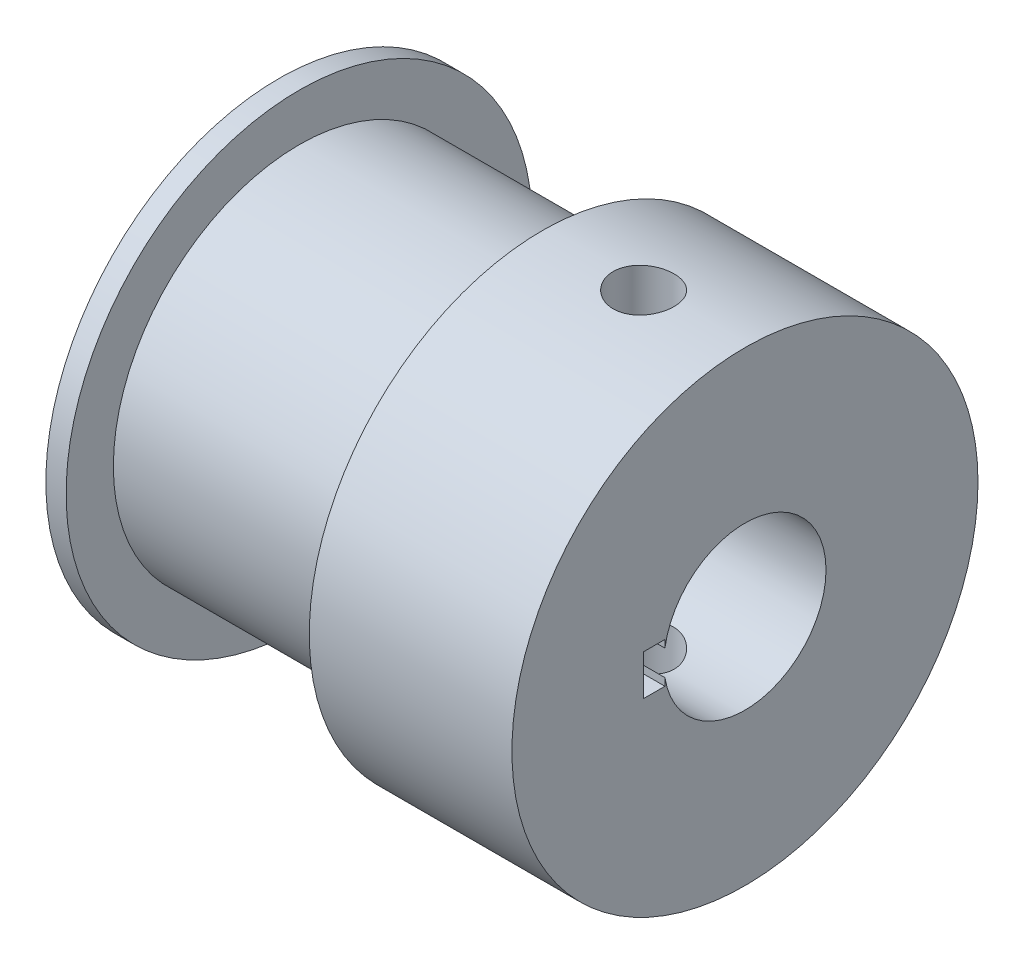
ISO-10303-21;
HEADER;
FILE_DESCRIPTION(('STEP AP214'),'2;1');
FILE_NAME('part.step','',(''),(''),'','','');
FILE_SCHEMA(('AUTOMOTIVE_DESIGN { 1 0 10303 214 1 1 1 1 }'));
ENDSEC;
DATA;
#1=APPLICATION_CONTEXT('core data for automotive mechanical design processes');
#2=APPLICATION_PROTOCOL_DEFINITION('international standard','automotive_design',2000,#1);
#3=PRODUCT_CONTEXT('',#1,'mechanical');
#4=PRODUCT('Part','Part','',(#3));
#5=PRODUCT_RELATED_PRODUCT_CATEGORY('part','',(#4));
#6=PRODUCT_DEFINITION_FORMATION('','',#4);
#7=PRODUCT_DEFINITION_CONTEXT('part definition',#1,'design');
#8=PRODUCT_DEFINITION('design','',#6,#7);
#9=PRODUCT_DEFINITION_SHAPE('','',#8);
#10=(LENGTH_UNIT() NAMED_UNIT(*) SI_UNIT(.MILLI.,.METRE.));
#11=(NAMED_UNIT(*) PLANE_ANGLE_UNIT() SI_UNIT($,.RADIAN.));
#12=(NAMED_UNIT(*) SI_UNIT($,.STERADIAN.) SOLID_ANGLE_UNIT());
#13=UNCERTAINTY_MEASURE_WITH_UNIT(LENGTH_MEASURE(1.E-05),#10,'distance_accuracy_value','');
#14=(GEOMETRIC_REPRESENTATION_CONTEXT(3) GLOBAL_UNCERTAINTY_ASSIGNED_CONTEXT((#13)) GLOBAL_UNIT_ASSIGNED_CONTEXT((#10,
#11,#12)) REPRESENTATION_CONTEXT('',''));
#15=CARTESIAN_POINT('',(0.,0.,0.));
#16=DIRECTION('',(0.,0.,1.));
#17=DIRECTION('',(1.,0.,0.));
#18=AXIS2_PLACEMENT_3D('',#15,#16,#17);
#19=CARTESIAN_POINT('',(0.007999999999981,11.5127,11.512749774016));
#20=DIRECTION('',(1.,0.,0.));
#21=DIRECTION('',(0.,0.,-1.));
#22=AXIS2_PLACEMENT_3D('',#19,#20,#21);
#23=CYLINDRICAL_SURFACE('',#22,11.5);
#24=CARTESIAN_POINT('',(0.007999999999996,11.5127,11.512749774016));
#25=DIRECTION('',(1.,0.,0.));
#26=DIRECTION('',(0.,0.,-1.));
#27=AXIS2_PLACEMENT_3D('',#24,#25,#26);
#28=CIRCLE('',#27,11.5);
#29=CARTESIAN_POINT('',(0.007999999999996,11.5127,0.012749774016));
#30=VERTEX_POINT('',#29);
#31=EDGE_CURVE('E19',#30,#30,#28,.T.);
#32=ORIENTED_EDGE('',*,*,#31,.T.);
#33=EDGE_LOOP('',(#32));
#34=FACE_BOUND('',#33,.T.);
#35=CARTESIAN_POINT('',(1.008,11.5127,11.512749774016));
#36=DIRECTION('',(1.,0.,0.));
#37=DIRECTION('',(0.,0.,-1.));
#38=AXIS2_PLACEMENT_3D('',#35,#36,#37);
#39=CIRCLE('',#38,11.5);
#40=CARTESIAN_POINT('',(1.008,11.5127,0.012749774016));
#41=VERTEX_POINT('',#40);
#42=EDGE_CURVE('E84',#41,#41,#39,.T.);
#43=ORIENTED_EDGE('',*,*,#42,.F.);
#44=EDGE_LOOP('',(#43));
#45=FACE_BOUND('',#44,.T.);
#46=ADVANCED_FACE('F16',(#34,#45),#23,.T.);
#47=CARTESIAN_POINT('',(1.008,11.5127,11.512749774016));
#48=DIRECTION('',(1.,0.,0.));
#49=DIRECTION('',(0.,0.,-1.));
#50=AXIS2_PLACEMENT_3D('',#47,#48,#49);
#51=PLANE('',#50);
#52=CARTESIAN_POINT('',(1.008,11.5127,11.512749774016));
#53=DIRECTION('',(1.,0.,0.));
#54=DIRECTION('',(0.,0.,-1.));
#55=AXIS2_PLACEMENT_3D('',#52,#53,#54);
#56=CIRCLE('',#55,9.168296585514);
#57=CARTESIAN_POINT('',(1.008,11.5127,2.344453188502));
#58=VERTEX_POINT('',#57);
#59=EDGE_CURVE('E123',#58,#58,#56,.T.);
#60=ORIENTED_EDGE('',*,*,#59,.F.);
#61=EDGE_LOOP('',(#60));
#62=FACE_BOUND('',#61,.T.);
#63=ORIENTED_EDGE('',*,*,#42,.T.);
#64=EDGE_LOOP('',(#63));
#65=FACE_BOUND('',#64,.T.);
#66=ADVANCED_FACE('F199',(#62,#65),#51,.T.);
#67=CARTESIAN_POINT('',(0.007999999999981,11.5127,11.512749774016));
#68=DIRECTION('',(1.,0.,0.));
#69=DIRECTION('',(0.,0.,-1.));
#70=AXIS2_PLACEMENT_3D('',#67,#68,#69);
#71=PLANE('',#70);
#72=DIRECTION('',(0.,0.,1.));
#73=VECTOR('',#72,1.);
#74=CARTESIAN_POINT('',(0.007999999999996,12.5127,15.462749774016));
#75=LINE('',#74,#73);
#76=CARTESIAN_POINT('',(0.007999999999996,12.5127,15.462749774016));
#77=VERTEX_POINT('',#76);
#78=CARTESIAN_POINT('',(0.00799999999999225,12.5127,16.5127497740164));
#79=VERTEX_POINT('',#78);
#80=EDGE_CURVE('E101',#77,#79,#75,.T.);
#81=ORIENTED_EDGE('',*,*,#80,.T.);
#82=DIRECTION('',(0.,1.,0.));
#83=VECTOR('',#82,1.);
#84=CARTESIAN_POINT('',(0.007999999999996,10.5127,16.512749774016));
#85=LINE('',#84,#83);
#86=CARTESIAN_POINT('',(0.0079999999999935,10.5127,16.5127497740162));
#87=VERTEX_POINT('',#86);
#88=EDGE_CURVE('E121',#79,#87,#85,.F.);
#89=ORIENTED_EDGE('',*,*,#88,.T.);
#90=DIRECTION('',(0.,0.,1.));
#91=VECTOR('',#90,1.);
#92=CARTESIAN_POINT('',(0.007999999999996,10.5127,15.462749774016));
#93=LINE('',#92,#91);
#94=CARTESIAN_POINT('',(0.007999999999996,10.5127,15.462749774016));
#95=VERTEX_POINT('',#94);
#96=EDGE_CURVE('E83',#95,#87,#93,.T.);
#97=ORIENTED_EDGE('',*,*,#96,.F.);
#98=DIRECTION('',(0.,1.,0.));
#99=VECTOR('',#98,1.);
#100=CARTESIAN_POINT('',(0.007999999999996,10.5127,15.462749774016));
#101=LINE('',#100,#99);
#102=CARTESIAN_POINT('',(0.007999999999996,10.8822239893541,15.462749774016));
#103=VERTEX_POINT('',#102);
#104=EDGE_CURVE('E81',#103,#95,#101,.F.);
#105=ORIENTED_EDGE('',*,*,#104,.F.);
#106=CARTESIAN_POINT('',(0.007999999999996,11.5127,11.512749774016));
#107=DIRECTION('',(1.,0.,0.));
#108=DIRECTION('',(0.,0.,-1.));
#109=AXIS2_PLACEMENT_3D('',#106,#107,#108);
#110=CIRCLE('',#109,4.);
#111=CARTESIAN_POINT('',(0.007999999999996,12.1431760106459,15.462749774016));
#112=VERTEX_POINT('',#111);
#113=EDGE_CURVE('E74',#112,#103,#110,.F.);
#114=ORIENTED_EDGE('',*,*,#113,.F.);
#115=DIRECTION('',(0.,1.,0.));
#116=VECTOR('',#115,1.);
#117=CARTESIAN_POINT('',(0.007999999999996,10.5127,15.462749774016));
#118=LINE('',#117,#116);
#119=EDGE_CURVE('E79',#77,#112,#118,.F.);
#120=ORIENTED_EDGE('',*,*,#119,.F.);
#121=EDGE_LOOP('',(#81,#89,#97,#105,#114,#120));
#122=FACE_BOUND('',#121,.T.);
#123=ORIENTED_EDGE('',*,*,#31,.F.);
#124=EDGE_LOOP('',(#123));
#125=FACE_BOUND('',#124,.T.);
#126=ADVANCED_FACE('F76',(#122,#125),#71,.F.);
#127=CARTESIAN_POINT('',(0.007999999999981,10.5127,15.462749774016));
#128=DIRECTION('',(0.,1.,0.));
#129=DIRECTION('',(0.,0.,1.));
#130=AXIS2_PLACEMENT_3D('',#127,#128,#129);
#131=PLANE('',#130);
#132=DIRECTION('',(1.,0.,0.));
#133=VECTOR('',#132,1.);
#134=CARTESIAN_POINT('',(0.007999999999981,10.5127,16.512749774016));
#135=LINE('',#134,#133);
#136=CARTESIAN_POINT('',(23.008,10.5127,16.5127497740169));
#137=VERTEX_POINT('',#136);
#138=EDGE_CURVE('E113',#87,#137,#135,.T.);
#139=ORIENTED_EDGE('',*,*,#138,.T.);
#140=DIRECTION('',(0.,0.,1.));
#141=VECTOR('',#140,1.);
#142=CARTESIAN_POINT('',(23.008,10.5127,15.462749774016));
#143=LINE('',#142,#141);
#144=CARTESIAN_POINT('',(23.008,10.5127,15.4627497740163));
#145=VERTEX_POINT('',#144);
#146=EDGE_CURVE('E109',#137,#145,#143,.F.);
#147=ORIENTED_EDGE('',*,*,#146,.T.);
#148=DIRECTION('',(1.,0.,0.));
#149=VECTOR('',#148,1.);
#150=CARTESIAN_POINT('',(0.007999999999981,10.5127,15.462749774016));
#151=LINE('',#150,#149);
#152=EDGE_CURVE('E226',#95,#145,#151,.T.);
#153=ORIENTED_EDGE('',*,*,#152,.F.);
#154=ORIENTED_EDGE('',*,*,#96,.T.);
#155=EDGE_LOOP('',(#139,#147,#153,#154));
#156=FACE_BOUND('',#155,.T.);
#157=ADVANCED_FACE('F194',(#156),#131,.T.);
#158=CARTESIAN_POINT('',(0.007999999999981,12.5127,15.462749774016));
#159=DIRECTION('',(0.,1.,0.));
#160=DIRECTION('',(0.,0.,1.));
#161=AXIS2_PLACEMENT_3D('',#158,#159,#160);
#162=PLANE('',#161);
#163=DIRECTION('',(1.,0.,0.));
#164=VECTOR('',#163,1.);
#165=CARTESIAN_POINT('',(0.007999999999981,12.5127,16.512749774016));
#166=LINE('',#165,#164);
#167=CARTESIAN_POINT('',(23.008,12.5127,16.5127497740168));
#168=VERTEX_POINT('',#167);
#169=EDGE_CURVE('E93',#168,#79,#166,.F.);
#170=ORIENTED_EDGE('',*,*,#169,.T.);
#171=ORIENTED_EDGE('',*,*,#80,.F.);
#172=DIRECTION('',(1.,0.,0.));
#173=VECTOR('',#172,1.);
#174=CARTESIAN_POINT('',(0.007999999999981,12.5127,15.462749774016));
#175=LINE('',#174,#173);
#176=CARTESIAN_POINT('',(23.008,12.5127,15.462749774016));
#177=VERTEX_POINT('',#176);
#178=EDGE_CURVE('E97',#177,#77,#175,.F.);
#179=ORIENTED_EDGE('',*,*,#178,.F.);
#180=DIRECTION('',(0.,0.,1.));
#181=VECTOR('',#180,1.);
#182=CARTESIAN_POINT('',(23.008,12.5127,15.462749774016));
#183=LINE('',#182,#181);
#184=EDGE_CURVE('E34',#168,#177,#183,.F.);
#185=ORIENTED_EDGE('',*,*,#184,.F.);
#186=EDGE_LOOP('',(#170,#171,#179,#185));
#187=FACE_BOUND('',#186,.T.);
#188=ADVANCED_FACE('F191',(#187),#162,.F.);
#189=CARTESIAN_POINT('',(0.007999999999981,10.5127,15.462749774016));
#190=DIRECTION('',(0.,0.,1.));
#191=DIRECTION('',(1.,0.,0.));
#192=AXIS2_PLACEMENT_3D('',#189,#190,#191);
#193=PLANE('',#192);
#194=DIRECTION('',(0.,1.,0.));
#195=VECTOR('',#194,1.);
#196=CARTESIAN_POINT('',(23.008,10.5127,15.462749774016));
#197=LINE('',#196,#195);
#198=CARTESIAN_POINT('',(23.008,12.1431760106459,15.462749774016));
#199=VERTEX_POINT('',#198);
#200=EDGE_CURVE('E98',#199,#177,#197,.T.);
#201=ORIENTED_EDGE('',*,*,#200,.T.);
#202=ORIENTED_EDGE('',*,*,#178,.T.);
#203=ORIENTED_EDGE('',*,*,#119,.T.);
#204=DIRECTION('',(1.,0.,0.));
#205=VECTOR('',#204,1.);
#206=CARTESIAN_POINT('',(13.008,12.1431760106458,15.462749774016));
#207=LINE('',#206,#205);
#208=EDGE_CURVE('E87',#112,#199,#207,.T.);
#209=ORIENTED_EDGE('',*,*,#208,.T.);
#210=EDGE_LOOP('',(#201,#202,#203,#209));
#211=FACE_BOUND('',#210,.T.);
#212=ADVANCED_FACE('F96',(#211),#193,.T.);
#213=CARTESIAN_POINT('',(0.007999999999981,10.5127,15.462749774016));
#214=DIRECTION('',(0.,0.,1.));
#215=DIRECTION('',(1.,0.,0.));
#216=AXIS2_PLACEMENT_3D('',#213,#214,#215);
#217=PLANE('',#216);
#218=DIRECTION('',(1.,0.,0.));
#219=VECTOR('',#218,1.);
#220=CARTESIAN_POINT('',(13.008,10.8822239893542,15.462749774016));
#221=LINE('',#220,#219);
#222=CARTESIAN_POINT('',(23.008,10.8822239893541,15.462749774016));
#223=VERTEX_POINT('',#222);
#224=EDGE_CURVE('E66',#223,#103,#221,.F.);
#225=ORIENTED_EDGE('',*,*,#224,.T.);
#226=ORIENTED_EDGE('',*,*,#104,.T.);
#227=ORIENTED_EDGE('',*,*,#152,.T.);
#228=DIRECTION('',(0.,1.,0.));
#229=VECTOR('',#228,1.);
#230=CARTESIAN_POINT('',(23.008,10.5127,15.462749774016));
#231=LINE('',#230,#229);
#232=EDGE_CURVE('E215',#145,#223,#231,.T.);
#233=ORIENTED_EDGE('',*,*,#232,.T.);
#234=EDGE_LOOP('',(#225,#226,#227,#233));
#235=FACE_BOUND('',#234,.T.);
#236=ADVANCED_FACE('F185',(#235),#217,.T.);
#237=CARTESIAN_POINT('',(0.007999999999981,11.5127,11.512749774016));
#238=DIRECTION('',(1.,0.,0.));
#239=DIRECTION('',(0.,0.,-1.));
#240=AXIS2_PLACEMENT_3D('',#237,#238,#239);
#241=CYLINDRICAL_SURFACE('',#240,9.168296585514);
#242=CARTESIAN_POINT('',(13.008,11.5127,11.512749774016));
#243=DIRECTION('',(1.,0.,0.));
#244=DIRECTION('',(0.,0.,-1.));
#245=AXIS2_PLACEMENT_3D('',#242,#243,#244);
#246=CIRCLE('',#245,9.168296585514);
#247=CARTESIAN_POINT('',(13.008,11.5127,2.344453188502));
#248=VERTEX_POINT('',#247);
#249=EDGE_CURVE('E216',#248,#248,#246,.F.);
#250=ORIENTED_EDGE('',*,*,#249,.T.);
#251=EDGE_LOOP('',(#250));
#252=FACE_BOUND('',#251,.T.);
#253=ORIENTED_EDGE('',*,*,#59,.T.);
#254=EDGE_LOOP('',(#253));
#255=FACE_BOUND('',#254,.T.);
#256=ADVANCED_FACE('F181',(#252,#255),#241,.T.);
#257=CARTESIAN_POINT('',(0.007999999999981,10.5127,16.512749774016));
#258=DIRECTION('',(0.,0.,1.));
#259=DIRECTION('',(1.,0.,0.));
#260=AXIS2_PLACEMENT_3D('',#257,#258,#259);
#261=PLANE('',#260);
#262=DIRECTION('',(0.,1.,0.));
#263=VECTOR('',#262,1.);
#264=CARTESIAN_POINT('',(23.008,11.5127,16.512749774017));
#265=LINE('',#264,#263);
#266=EDGE_CURVE('E116',#137,#168,#265,.T.);
#267=ORIENTED_EDGE('',*,*,#266,.F.);
#268=ORIENTED_EDGE('',*,*,#138,.F.);
#269=ORIENTED_EDGE('',*,*,#88,.F.);
#270=ORIENTED_EDGE('',*,*,#169,.F.);
#271=EDGE_LOOP('',(#267,#268,#269,#270));
#272=FACE_BOUND('',#271,.T.);
#273=ADVANCED_FACE('F176',(#272),#261,.F.);
#274=CARTESIAN_POINT('',(13.008,11.5127,11.512749774016));
#275=DIRECTION('',(1.,0.,0.));
#276=DIRECTION('',(0.,0.,-1.));
#277=AXIS2_PLACEMENT_3D('',#274,#275,#276);
#278=CYLINDRICAL_SURFACE('',#277,4.);
#279=CARTESIAN_POINT('',(19.508,15.5127,11.512749774017));
#280=CARTESIAN_POINT('',(19.5079953109947,15.5126964151413,11.4316381310285));
#281=CARTESIAN_POINT('',(19.5013893874515,15.5102065011371,11.350450554378));
#282=CARTESIAN_POINT('',(19.4752066003945,15.5005005452051,11.1904136181582));
#283=CARTESIAN_POINT('',(19.4556099337964,15.4932772879637,11.1115680207227));
#284=CARTESIAN_POINT('',(19.4042423134753,15.4748864368417,10.9586805417857));
#285=CARTESIAN_POINT('',(19.3725030957924,15.4637291309838,10.8846267213654));
#286=CARTESIAN_POINT('',(19.2978799190629,15.4385832837473,10.7429276167405));
#287=CARTESIAN_POINT('',(19.2549965496297,15.424594892164,10.6752819937499));
#288=CARTESIAN_POINT('',(19.1573885883821,15.3945627952408,10.5454052019143));
#289=CARTESIAN_POINT('',(19.1022722848971,15.3784607647132,10.4834819971432));
#290=CARTESIAN_POINT('',(18.9825925646278,15.3463029601823,10.3695078876926));
#291=CARTESIAN_POINT('',(18.9180258320558,15.3302472044394,10.3174604628192));
#292=CARTESIAN_POINT('',(18.7782824785688,15.2993246925217,10.222767739993));
#293=CARTESIAN_POINT('',(18.702795528039,15.2845264670519,10.1805557896169));
#294=CARTESIAN_POINT('',(18.5451515339996,15.258698587825,10.1095632652704));
#295=CARTESIAN_POINT('',(18.4629971793018,15.2476674241528,10.0807773081922));
#296=CARTESIAN_POINT('',(18.2978832238214,15.2312441245558,10.0386654561513));
#297=CARTESIAN_POINT('',(18.2150948882981,15.2256392385569,10.0247538296246));
#298=CARTESIAN_POINT('',(18.0481837675621,15.2200806146397,10.0109542086863));
#299=CARTESIAN_POINT('',(17.9640615490558,15.2201245378876,10.0110604103318));
#300=CARTESIAN_POINT('',(17.8022306207428,15.2256751112927,10.0248454643695));
#301=CARTESIAN_POINT('',(17.7244393838181,15.2308546693362,10.0377116366168));
#302=CARTESIAN_POINT('',(17.5722131272187,15.2455493450564,10.0753080074765));
#303=CARTESIAN_POINT('',(17.4977786273788,15.2550651317385,10.1000400368171));
#304=CARTESIAN_POINT('',(17.3527212531937,15.2775572827378,10.1611129790847));
#305=CARTESIAN_POINT('',(17.2821972788831,15.2905957798671,10.1976649026618));
#306=CARTESIAN_POINT('',(17.1480513274794,15.3186427916405,10.2811912623859));
#307=CARTESIAN_POINT('',(17.0844314260563,15.3336518957559,10.3281688200851));
#308=CARTESIAN_POINT('',(16.9614061170473,15.3651778893324,10.4349232426978));
#309=CARTESIAN_POINT('',(16.9025695389997,15.381728390156,10.4953472220996));
#310=CARTESIAN_POINT('',(16.7956767659011,15.4136125484395,10.6254166989206));
#311=CARTESIAN_POINT('',(16.7476255477869,15.4289456420226,10.6950664301144));
#312=CARTESIAN_POINT('',(16.6630359563751,15.4569752164329,10.8430820513489));
#313=CARTESIAN_POINT('',(16.6266955959957,15.4696252251829,10.9215703171281));
#314=CARTESIAN_POINT('',(16.5679803953588,15.4905003034469,11.0840611316344));
#315=CARTESIAN_POINT('',(16.5455773034259,15.4987343197347,11.1680521412159));
#316=CARTESIAN_POINT('',(16.5230813319698,15.507063925809,11.2961670155175));
#317=CARTESIAN_POINT('',(16.5174340689345,15.5091702826106,11.3392549214816));
#318=CARTESIAN_POINT('',(16.5098921517374,15.5119892785148,11.4258045360034));
#319=CARTESIAN_POINT('',(16.5079974862486,15.5127019218242,11.4692662434325));
#320=CARTESIAN_POINT('',(16.5080046890054,15.5126964151412,11.5938614170055));
#321=CARTESIAN_POINT('',(16.5146106125487,15.510206501137,11.675048993656));
#322=CARTESIAN_POINT('',(16.540793399606,15.5005005452049,11.8350859298758));
#323=CARTESIAN_POINT('',(16.5603900662042,15.4932772879635,11.9139315273113));
#324=CARTESIAN_POINT('',(16.6117576865255,15.4748864368415,12.0668190062483));
#325=CARTESIAN_POINT('',(16.6434969042084,15.4637291309835,12.1408728266685));
#326=CARTESIAN_POINT('',(16.7181200809382,15.4385832837469,12.2825719312934));
#327=CARTESIAN_POINT('',(16.7610034503715,15.4245948921637,12.3502175542839));
#328=CARTESIAN_POINT('',(16.8586114116193,15.3945627952403,12.4800943461194));
#329=CARTESIAN_POINT('',(16.9137277151044,15.3784607647128,12.5420175508904));
#330=CARTESIAN_POINT('',(17.0334074353739,15.3463029601819,12.6559916603408));
#331=CARTESIAN_POINT('',(17.097974167946,15.330247204439,12.7080390852142));
#332=CARTESIAN_POINT('',(17.2377175214332,15.2993246925213,12.8027318080402));
#333=CARTESIAN_POINT('',(17.3132044719631,15.2845264670516,12.8449437584162));
#334=CARTESIAN_POINT('',(17.4708484660025,15.2586985878247,12.9159362827624));
#335=CARTESIAN_POINT('',(17.5530028207004,15.2476674241525,12.9447222398405));
#336=CARTESIAN_POINT('',(17.7181167761808,15.2312441245556,12.9868340918811));
#337=CARTESIAN_POINT('',(17.8009051117042,15.2256392385568,13.0007457184077));
#338=CARTESIAN_POINT('',(17.9678162324401,15.2200806146396,13.0145453393458));
#339=CARTESIAN_POINT('',(18.0519384509464,15.2201245378876,13.0144391377002));
#340=CARTESIAN_POINT('',(18.2137693792593,15.2256751112929,13.0006540836622));
#341=CARTESIAN_POINT('',(18.291560616184,15.2308546693364,12.9877879114148));
#342=CARTESIAN_POINT('',(18.4437868727834,15.2455493450567,12.9501915405549));
#343=CARTESIAN_POINT('',(18.5182213726231,15.2550651317388,12.9254595112142));
#344=CARTESIAN_POINT('',(18.6632787468082,15.2775572827382,12.8643865689464));
#345=CARTESIAN_POINT('',(18.7338027211188,15.2905957798674,12.8278346453692));
#346=CARTESIAN_POINT('',(18.8679486725223,15.3186427916409,12.7443082856449));
#347=CARTESIAN_POINT('',(18.9315685739454,15.3336518957563,12.6973307279456));
#348=CARTESIAN_POINT('',(19.0545938829542,15.3651778893328,12.5905763053327));
#349=CARTESIAN_POINT('',(19.1134304610018,15.3817283901565,12.5301523259308));
#350=CARTESIAN_POINT('',(19.2203232341002,15.4136125484399,12.4000828491096));
#351=CARTESIAN_POINT('',(19.2683744522143,15.428945642023,12.3304331179157));
#352=CARTESIAN_POINT('',(19.3529640436259,15.4569752164332,12.182417496681));
#353=CARTESIAN_POINT('',(19.3893044040052,15.4696252251832,12.1039292309018));
#354=CARTESIAN_POINT('',(19.4480196046419,15.4905003034472,11.9414384163954));
#355=CARTESIAN_POINT('',(19.4704226965746,15.4987343197349,11.8574474068139));
#356=CARTESIAN_POINT('',(19.4929186680304,15.5070639258091,11.7293325325129));
#357=CARTESIAN_POINT('',(19.4985659310656,15.5091702826107,11.6862446265496));
#358=CARTESIAN_POINT('',(19.5061078482625,15.5119892785148,11.5996950120291));
#359=CARTESIAN_POINT('',(19.5080025137514,15.5127019218242,11.5562333046008));
#360=CARTESIAN_POINT('',(19.508,15.5127,11.512749774017));
#361=B_SPLINE_CURVE_WITH_KNOTS('',3,(#279,#280,#281,#282,#283,#284,#285,#286,#287,#288,#289,
#290,#291,#292,#293,#294,#295,#296,#297,#298,#299,#300,#301,#302,#303,#304,#305,#306,#307,#308,
#309,#310,#311,#312,#313,#314,#315,#316,#317,#318,#319,#320,#321,#322,#323,#324,#325,#326,#327,
#328,#329,#330,#331,#332,#333,#334,#335,#336,#337,#338,#339,#340,#341,#342,#343,#344,#345,#346,
#347,#348,#349,#350,#351,#352,#353,#354,#355,#356,#357,#358,#359,#360),.UNSPECIFIED.,.T.,.F.,(4,
2,2,2,2,2,2,2,2,2,2,2,2,2,2,2,2,2,2,2,2,2,2,2,2,2,2,2,2,2,2,2,2,2,2,2,2,2,2,2,4),(0.,
0.243166514302271,0.486704566599172,0.729610403544376,0.972503391468698,1.22473037141663,
1.47704606108106,1.73896693662255,2.00078270538413,2.25185886666093,2.50283107266735,
2.73878302477865,2.97477139254027,3.21522960902618,3.45575991877758,3.71242215551964,
3.96920258743884,4.2301211313288,4.49050903953838,4.6208697385546,4.75123004408176,
4.99439655838408,5.23793461068102,5.48084044762627,5.72373343555064,5.97596041549864,
6.22827610516314,6.49019698070463,6.7520127494662,7.00308891074291,7.25406111674926,
7.49001306886053,7.72600143662212,7.96645965310809,8.20698996285955,8.46365219960167,
8.72043263152094,8.98135117541087,9.24173908362041,9.3720997826345,9.50246008815953),.UNSPECIFIED.);
#362=CARTESIAN_POINT('',(19.508,15.5127,11.512749774017));
#363=VERTEX_POINT('',#362);
#364=EDGE_CURVE('E118',#363,#363,#361,.T.);
#365=ORIENTED_EDGE('',*,*,#364,.T.);
#366=EDGE_LOOP('',(#365));
#367=FACE_BOUND('',#366,.T.);
#368=CARTESIAN_POINT('',(19.508,7.5127,11.512749774017));
#369=CARTESIAN_POINT('',(19.5080029023031,7.51269782543851,11.5939848329549));
#370=CARTESIAN_POINT('',(19.5013802397515,7.5151962071682,11.6752000157988));
#371=CARTESIAN_POINT('',(19.4751718047298,7.52491303993081,11.8352032263694));
#372=CARTESIAN_POINT('',(19.4555878995292,7.53213081106017,11.9139916020046));
#373=CARTESIAN_POINT('',(19.4042469982279,7.55051167608469,12.0668105590079));
#374=CARTESIAN_POINT('',(19.3725134831778,7.56166715650575,12.1408499981792));
#375=CARTESIAN_POINT('',(19.2978935869836,7.58681232234665,12.2825490841772));
#376=CARTESIAN_POINT('',(19.2550042144553,7.60080276772471,12.3502070131948));
#377=CARTESIAN_POINT('',(19.1573874689284,7.63083753028804,12.4800961910627));
#378=CARTESIAN_POINT('',(19.1022697377398,7.64693997416455,12.542020504168));
#379=CARTESIAN_POINT('',(18.9825895653403,7.67909779128695,12.6559939887604));
#380=CARTESIAN_POINT('',(18.9180242439112,7.69515314864989,12.7080401376087));
#381=CARTESIAN_POINT('',(18.7782825324758,7.72607529382289,12.8027317961764));
#382=CARTESIAN_POINT('',(18.7027956334532,7.740873511792,12.8449437059741));
#383=CARTESIAN_POINT('',(18.5451516458304,7.76670139762582,12.9159362373573));
#384=CARTESIAN_POINT('',(18.4629972368438,7.77773257024133,12.9447222236287));
#385=CARTESIAN_POINT('',(18.2978832597407,7.79415587175873,12.9868340841917));
#386=CARTESIAN_POINT('',(18.2150949615634,7.79976075649169,13.0007457062017));
#387=CARTESIAN_POINT('',(18.0481838420051,7.80531938538787,13.0145453393325));
#388=CARTESIAN_POINT('',(17.9640615861244,7.80527546340694,13.0144391420423));
#389=CARTESIAN_POINT('',(17.802230474786,7.7997248836794,13.000654070116));
#390=CARTESIAN_POINT('',(17.7244390939548,7.79454531128871,12.9877878591058));
#391=CARTESIAN_POINT('',(17.5722128495937,7.77985061940459,12.950191452699));
#392=CARTESIAN_POINT('',(17.4977784933851,7.77033484701124,12.9254594706482));
#393=CARTESIAN_POINT('',(17.3527229322708,7.74784297809731,12.8643872597346));
#394=CARTESIAN_POINT('',(17.2822005138778,7.73480482011817,12.8278362613865));
#395=CARTESIAN_POINT('',(17.1480542624082,7.70675789860661,12.7443105116424));
#396=CARTESIAN_POINT('',(17.0844328224795,7.69174845542822,12.6973321613043));
#397=CARTESIAN_POINT('',(16.9613963363483,7.66021961140866,12.5905675816807));
#398=CARTESIAN_POINT('',(16.9025513592512,7.64366652544308,12.5301327611847));
#399=CARTESIAN_POINT('',(16.7956620337935,7.61178271835894,12.4000623648341));
#400=CARTESIAN_POINT('',(16.7476193453937,7.59645218534028,12.3304253775124));
#401=CARTESIAN_POINT('',(16.663069602937,7.56843605190903,12.1824732110074));
#402=CARTESIAN_POINT('',(16.6267524187785,7.55579501740368,12.1040404878597));
#403=CARTESIAN_POINT('',(16.5680173957296,7.53491281673026,11.9415866245395));
#404=CARTESIAN_POINT('',(16.5455933834386,7.52666969658497,11.8575679848607));
#405=CARTESIAN_POINT('',(16.5163772124579,7.5158555677193,11.6911250171635));
#406=CARTESIAN_POINT('',(16.5088173936174,7.51300630974311,11.6088533935771));
#407=CARTESIAN_POINT('',(16.5073089361001,7.51244106299876,11.4441772987599));
#408=CARTESIAN_POINT('',(16.5133572796833,7.51472393613141,11.3617728610316));
#409=CARTESIAN_POINT('',(16.5383100423089,7.52398290227365,11.2024877254531));
#410=CARTESIAN_POINT('',(16.5567115437374,7.53077529037705,11.1255164460076));
#411=CARTESIAN_POINT('',(16.6051860725477,7.54818522908296,10.9758080190578));
#412=CARTESIAN_POINT('',(16.6352606179485,7.55880327717985,10.9030714236675));
#413=CARTESIAN_POINT('',(16.70718641244,7.58320375592336,10.7615020089049));
#414=CARTESIAN_POINT('',(16.749357729224,7.59706999790671,10.6928466904573));
#415=CARTESIAN_POINT('',(16.8439181031722,7.62643328435357,10.5633570622885));
#416=CARTESIAN_POINT('',(16.8963109325459,7.64193092990505,10.5025256537447));
#417=CARTESIAN_POINT('',(17.0134041221251,7.67396670509032,10.3867189752707));
#418=CARTESIAN_POINT('',(17.0786421827736,7.69051303496292,10.3322882327796));
#419=CARTESIAN_POINT('',(17.2176513847086,7.72191184253167,10.2350392736964));
#420=CARTESIAN_POINT('',(17.2914232913895,7.7367641680562,10.1922220998703));
#421=CARTESIAN_POINT('',(17.4460159867734,7.76303170177553,10.1193720388256));
#422=CARTESIAN_POINT('',(17.5268647459115,7.77443239671521,10.0893929195465));
#423=CARTESIAN_POINT('',(17.6930097636889,7.79215967109004,10.0436709393469));
#424=CARTESIAN_POINT('',(17.7783032361992,7.79848938942516,10.0279192709605));
#425=CARTESIAN_POINT('',(17.9450161595422,7.80494105207428,10.0118863030376));
#426=CARTESIAN_POINT('',(18.026332631718,7.80543555476659,10.0106764590576));
#427=CARTESIAN_POINT('',(18.1879453162772,7.80111587254703,10.0213826176002));
#428=CARTESIAN_POINT('',(18.2682416246726,7.79630219101094,10.0332973755149));
#429=CARTESIAN_POINT('',(18.4230472267176,7.78221858414556,10.0691916177139));
#430=CARTESIAN_POINT('',(18.4976583462463,7.77308914623324,10.0927917908511));
#431=CARTESIAN_POINT('',(18.6419055084954,7.75148451702139,10.1510528062172));
#432=CARTESIAN_POINT('',(18.7115402880711,7.73900848004768,10.185716444567));
#433=CARTESIAN_POINT('',(18.8478267896985,7.71130276096016,10.2672290146351));
#434=CARTESIAN_POINT('',(18.9141307968008,7.69596301559016,10.3146214459865));
#435=CARTESIAN_POINT('',(19.038141560972,7.66463753242802,10.4194049167177));
#436=CARTESIAN_POINT('',(19.0958455747875,7.64865159056834,10.4767991338887));
#437=CARTESIAN_POINT('',(19.2042019558225,7.61679575390098,10.6036693772323));
#438=CARTESIAN_POINT('',(19.2543037534353,7.60097895099335,10.6736311298039));
#439=CARTESIAN_POINT('',(19.3420226552771,7.57215485542952,10.8215365508162));
#440=CARTESIAN_POINT('',(19.3796387877368,7.55914778148424,10.8994808399264));
#441=CARTESIAN_POINT('',(19.4423768290487,7.53695707393308,11.0647506920148));
#442=CARTESIAN_POINT('',(19.4668870646022,7.52796342841634,11.1523363517829));
#443=CARTESIAN_POINT('',(19.4996929599208,7.51583757820409,11.3308740404107));
#444=CARTESIAN_POINT('',(19.5079967514874,7.51270243396031,11.4218243576522));
#445=CARTESIAN_POINT('',(19.508,7.5127,11.512749774017));
#446=B_SPLINE_CURVE_WITH_KNOTS('',3,(#368,#369,#370,#371,#372,#373,#374,#375,#376,#377,#378,
#379,#380,#381,#382,#383,#384,#385,#386,#387,#388,#389,#390,#391,#392,#393,#394,#395,#396,#397,
#398,#399,#400,#401,#402,#403,#404,#405,#406,#407,#408,#409,#410,#411,#412,#413,#414,#415,#416,
#417,#418,#419,#420,#421,#422,#423,#424,#425,#426,#427,#428,#429,#430,#431,#432,#433,#434,#435,
#436,#437,#438,#439,#440,#441,#442,#443,#444,#445),.UNSPECIFIED.,.T.,.F.,(4,2,2,2,2,2,2,2,2,2,2,
2,2,2,2,2,2,2,2,2,2,2,2,2,2,2,2,2,2,2,2,2,2,2,2,2,2,2,4),(0.,0.243369801560582,
0.486704549530506,0.72957136921364,0.972503379609579,1.22473618582728,1.47704604925637,
1.73896674501675,2.00078269352149,2.25185874416913,2.50283106079715,2.73878345119977,
2.97477138060593,3.21522408387025,3.45575990744269,3.71246153335826,3.96920257905083,
4.2299137528609,4.49050899698859,4.73725019635935,4.98393668390527,5.22114437923846,
5.45838293254459,5.70259221859609,5.9468918001988,6.20536519455672,6.46386178920158,
6.72343066727219,6.98283874956519,7.2255876348026,7.46831350211263,7.70363142426539,
7.93900886656513,8.18672471884281,8.43451941997076,8.69572329654055,8.95694749805119,
9.2294851503205,9.50188601796127),.UNSPECIFIED.);
#447=CARTESIAN_POINT('',(19.508,7.5127,11.512749774017));
#448=VERTEX_POINT('',#447);
#449=EDGE_CURVE('E167',#448,#448,#446,.T.);
#450=ORIENTED_EDGE('',*,*,#449,.T.);
#451=EDGE_LOOP('',(#450));
#452=FACE_BOUND('',#451,.T.);
#453=CARTESIAN_POINT('',(23.008,11.5127,11.512749774016));
#454=DIRECTION('',(1.,0.,0.));
#455=DIRECTION('',(0.,0.,-1.));
#456=AXIS2_PLACEMENT_3D('',#453,#454,#455);
#457=CIRCLE('',#456,4.);
#458=EDGE_CURVE('E90',#199,#223,#457,.F.);
#459=ORIENTED_EDGE('',*,*,#458,.F.);
#460=ORIENTED_EDGE('',*,*,#208,.F.);
#461=ORIENTED_EDGE('',*,*,#113,.T.);
#462=ORIENTED_EDGE('',*,*,#224,.F.);
#463=EDGE_LOOP('',(#459,#460,#461,#462));
#464=FACE_BOUND('',#463,.T.);
#465=ADVANCED_FACE('F88',(#367,#452,#464),#278,.F.);
#466=CARTESIAN_POINT('',(13.008,11.5127,11.512749774016));
#467=DIRECTION('',(1.,0.,0.));
#468=DIRECTION('',(0.,0.,-1.));
#469=AXIS2_PLACEMENT_3D('',#466,#467,#468);
#470=PLANE('',#469);
#471=ORIENTED_EDGE('',*,*,#249,.F.);
#472=EDGE_LOOP('',(#471));
#473=FACE_BOUND('',#472,.T.);
#474=CARTESIAN_POINT('',(13.008,11.5127,11.512749774016));
#475=DIRECTION('',(1.,0.,0.));
#476=DIRECTION('',(0.,0.,-1.));
#477=AXIS2_PLACEMENT_3D('',#474,#475,#476);
#478=CIRCLE('',#477,11.5);
#479=CARTESIAN_POINT('',(13.008,11.5127,0.012749774016));
#480=VERTEX_POINT('',#479);
#481=EDGE_CURVE('E150',#480,#480,#478,.T.);
#482=ORIENTED_EDGE('',*,*,#481,.F.);
#483=EDGE_LOOP('',(#482));
#484=FACE_BOUND('',#483,.T.);
#485=ADVANCED_FACE('F175',(#473,#484),#470,.F.);
#486=CARTESIAN_POINT('',(23.008,11.5127,11.512749774016));
#487=DIRECTION('',(1.,0.,0.));
#488=DIRECTION('',(0.,0.,-1.));
#489=AXIS2_PLACEMENT_3D('',#486,#487,#488);
#490=PLANE('',#489);
#491=ORIENTED_EDGE('',*,*,#184,.T.);
#492=ORIENTED_EDGE('',*,*,#200,.F.);
#493=ORIENTED_EDGE('',*,*,#458,.T.);
#494=ORIENTED_EDGE('',*,*,#232,.F.);
#495=ORIENTED_EDGE('',*,*,#146,.F.);
#496=ORIENTED_EDGE('',*,*,#266,.T.);
#497=EDGE_LOOP('',(#491,#492,#493,#494,#495,#496));
#498=FACE_BOUND('',#497,.T.);
#499=CARTESIAN_POINT('',(23.008,11.5127,11.512749774016));
#500=DIRECTION('',(1.,0.,0.));
#501=DIRECTION('',(0.,0.,-1.));
#502=AXIS2_PLACEMENT_3D('',#499,#500,#501);
#503=CIRCLE('',#502,11.5);
#504=CARTESIAN_POINT('',(23.008,11.5127,0.012749774016));
#505=VERTEX_POINT('',#504);
#506=EDGE_CURVE('E25',#505,#505,#503,.F.);
#507=ORIENTED_EDGE('',*,*,#506,.F.);
#508=EDGE_LOOP('',(#507));
#509=FACE_BOUND('',#508,.T.);
#510=ADVANCED_FACE('F156',(#498,#509),#490,.T.);
#511=CARTESIAN_POINT('',(18.008,23.0127,11.512749774016));
#512=DIRECTION('',(0.,-1.,0.));
#513=DIRECTION('',(0.,0.,-1.));
#514=AXIS2_PLACEMENT_3D('',#511,#512,#513);
#515=CYLINDRICAL_SURFACE('',#514,1.5);
#516=CARTESIAN_POINT('',(16.508,23.0127,11.512749774017));
#517=CARTESIAN_POINT('',(16.5080037109735,23.0126987730221,11.4289534257321));
#518=CARTESIAN_POINT('',(16.5150511228817,23.0117737252684,11.345047640067));
#519=CARTESIAN_POINT('',(16.5430676610449,23.0081704389512,11.179513997505));
#520=CARTESIAN_POINT('',(16.5640656531219,23.0054885654158,11.0978912302044));
#521=CARTESIAN_POINT('',(16.619354853628,22.9986735112515,10.9394314950446));
#522=CARTESIAN_POINT('',(16.6536315817153,22.9945419119965,10.8625894194588));
#523=CARTESIAN_POINT('',(16.7344749461793,22.9852873794224,10.7157833551366));
#524=CARTESIAN_POINT('',(16.7810365338548,22.980164853574,10.6458165570461));
#525=CARTESIAN_POINT('',(16.8854343853598,22.9694644007671,10.5142840263734));
#526=CARTESIAN_POINT('',(16.9433305298256,22.9638841508295,10.4527660017708));
#527=CARTESIAN_POINT('',(17.0686279547455,22.9529155967961,10.3402869949232));
#528=CARTESIAN_POINT('',(17.1360302059891,22.9475273123747,10.2893270922162));
#529=CARTESIAN_POINT('',(17.27872950767,22.9375308313537,10.1992393396857));
#530=CARTESIAN_POINT('',(17.3540545326115,22.9329255601096,10.1601554488462));
#531=CARTESIAN_POINT('',(17.5102686531101,22.9250467761879,10.0952104353476));
#532=CARTESIAN_POINT('',(17.5911574704853,22.9217731969839,10.0693486521456));
#533=CARTESIAN_POINT('',(17.7557161530666,22.9169503189956,10.0317244351432));
#534=CARTESIAN_POINT('',(17.8393675941829,22.9153913236731,10.0198826839817));
#535=CARTESIAN_POINT('',(18.0074839686317,22.9141445119759,10.0103891921952));
#536=CARTESIAN_POINT('',(18.0919488676971,22.914456617122,10.0127368564261));
#537=CARTESIAN_POINT('',(18.2587392929482,22.9169078644506,10.0314904627287));
#538=CARTESIAN_POINT('',(18.3410748705354,22.9190356096591,10.0478087119931));
#539=CARTESIAN_POINT('',(18.501829735327,22.9248606430721,10.0939036086533));
#540=CARTESIAN_POINT('',(18.5802489024547,22.9285579793669,10.1236806684135));
#541=CARTESIAN_POINT('',(18.7312179042064,22.9371185984798,10.1959427147902));
#542=CARTESIAN_POINT('',(18.8037491824125,22.9419853896111,10.2384660364616));
#543=CARTESIAN_POINT('',(18.9406736929305,22.9523333790337,10.3349824590886));
#544=CARTESIAN_POINT('',(19.005067174922,22.9578145584651,10.3889752080089));
#545=CARTESIAN_POINT('',(19.1243923060736,22.9688236323729,10.5073720664291));
#546=CARTESIAN_POINT('',(19.1792509553031,22.9743515741735,10.5718497611331));
#547=CARTESIAN_POINT('',(19.2774037793907,22.9847963865519,10.709171507983));
#548=CARTESIAN_POINT('',(19.3206926745695,22.9897129776039,10.7820193581125));
#549=CARTESIAN_POINT('',(19.3944734964217,22.9983849911448,10.9340902545103));
#550=CARTESIAN_POINT('',(19.4249500735271,23.0021390194368,11.0133208128853));
#551=CARTESIAN_POINT('',(19.472082816611,23.0080461777038,11.1757281567769));
#552=CARTESIAN_POINT('',(19.4887682255371,23.0102026940477,11.2588961949702));
#553=CARTESIAN_POINT('',(19.501557597659,23.0118612558376,11.3709898822303));
#554=CARTESIAN_POINT('',(19.5039716583179,23.0121751432474,11.3992836021387));
#555=CARTESIAN_POINT('',(19.5071934886642,23.0125947232883,11.4559639494181));
#556=CARTESIAN_POINT('',(19.5080012576762,23.0127004158318,11.4843505768283));
#557=CARTESIAN_POINT('',(19.5079962890264,23.0126987730221,11.5965461223019));
#558=CARTESIAN_POINT('',(19.500948877118,23.0117737252684,11.680451907967));
#559=CARTESIAN_POINT('',(19.4729323389546,23.0081704389512,11.845985550529));
#560=CARTESIAN_POINT('',(19.4519343468776,23.0054885654157,11.9276083178296));
#561=CARTESIAN_POINT('',(19.3966451463712,22.9986735112514,12.0860680529893));
#562=CARTESIAN_POINT('',(19.3623684182838,22.9945419119964,12.162910128575));
#563=CARTESIAN_POINT('',(19.2815250538196,22.9852873794223,12.3097161928972));
#564=CARTESIAN_POINT('',(19.234963466144,22.9801648535739,12.3796829909876));
#565=CARTESIAN_POINT('',(19.1305656146389,22.969464400767,12.5112155216601));
#566=CARTESIAN_POINT('',(19.072669470173,22.9638841508294,12.5727335462627));
#567=CARTESIAN_POINT('',(18.9473720452529,22.952915596796,12.6852125531101));
#568=CARTESIAN_POINT('',(18.8799697940093,22.9475273123746,12.736172455817));
#569=CARTESIAN_POINT('',(18.7372704923282,22.9375308313536,12.8262602083472));
#570=CARTESIAN_POINT('',(18.6619454673867,22.9329255601095,12.8653440991867));
#571=CARTESIAN_POINT('',(18.5057313468879,22.9250467761878,12.9302891126851));
#572=CARTESIAN_POINT('',(18.4248425295127,22.9217731969838,12.956150895887));
#573=CARTESIAN_POINT('',(18.2602838469314,22.9169503189956,12.9937751128892));
#574=CARTESIAN_POINT('',(18.1766324058151,22.9153913236731,13.0056168640505));
#575=CARTESIAN_POINT('',(18.0085160313663,22.9141445119759,13.0151103558368));
#576=CARTESIAN_POINT('',(17.9240511323009,22.914456617122,13.0127626916057));
#577=CARTESIAN_POINT('',(17.7572607070498,22.9169078644506,12.994009085303));
#578=CARTESIAN_POINT('',(17.6749251294626,22.9190356096592,12.9776908360384));
#579=CARTESIAN_POINT('',(17.5141702646711,22.9248606430721,12.9315959393781));
#580=CARTESIAN_POINT('',(17.4357510975435,22.928557979367,12.9018188796177));
#581=CARTESIAN_POINT('',(17.2847820957919,22.9371185984799,12.8295568332408));
#582=CARTESIAN_POINT('',(17.2122508175858,22.9419853896112,12.7870335115693));
#583=CARTESIAN_POINT('',(17.0753263070679,22.9523333790339,12.6905170889422));
#584=CARTESIAN_POINT('',(17.0109328250764,22.9578145584652,12.6365243400218));
#585=CARTESIAN_POINT('',(16.891607693925,22.968823632373,12.5181274816014));
#586=CARTESIAN_POINT('',(16.8367490446956,22.9743515741736,12.4536497868973));
#587=CARTESIAN_POINT('',(16.7385962206082,22.9847963865521,12.3163280400473));
#588=CARTESIAN_POINT('',(16.6953073254295,22.9897129776041,12.2434801899177));
#589=CARTESIAN_POINT('',(16.6215265035775,22.9983849911449,12.0914092935198));
#590=CARTESIAN_POINT('',(16.5910499264722,23.0021390194369,12.0121787351447));
#591=CARTESIAN_POINT('',(16.5439171833885,23.0080461777039,11.8497713912531));
#592=CARTESIAN_POINT('',(16.5272317744626,23.0102026940477,11.7666033530597));
#593=CARTESIAN_POINT('',(16.5144424023409,23.0118612558376,11.6545096658004));
#594=CARTESIAN_POINT('',(16.5120283416821,23.0121751432474,11.6262159458926));
#595=CARTESIAN_POINT('',(16.5088065113358,23.0125947232883,11.5695355986145));
#596=CARTESIAN_POINT('',(16.5079987423239,23.0127004158318,11.5411489712051));
#597=CARTESIAN_POINT('',(16.508,23.0127,11.512749774017));
#598=B_SPLINE_CURVE_WITH_KNOTS('',3,(#516,#517,#518,#519,#520,#521,#522,#523,#524,#525,#526,
#527,#528,#529,#530,#531,#532,#533,#534,#535,#536,#537,#538,#539,#540,#541,#542,#543,#544,#545,
#546,#547,#548,#549,#550,#551,#552,#553,#554,#555,#556,#557,#558,#559,#560,#561,#562,#563,#564,
#565,#566,#567,#568,#569,#570,#571,#572,#573,#574,#575,#576,#577,#578,#579,#580,#581,#582,#583,
#584,#585,#586,#587,#588,#589,#590,#591,#592,#593,#594,#595,#596,#597),.UNSPECIFIED.,.T.,.F.,(4,
2,2,2,2,2,2,2,2,2,2,2,2,2,2,2,2,2,2,2,2,2,2,2,2,2,2,2,2,2,2,2,2,2,2,2,2,2,2,2,4),(0.,
0.251280796518457,0.503083156391791,0.754611697514981,1.00603702868845,1.25882834672883,
1.51164549922376,1.76538736244322,2.01911654812356,2.27140331292807,2.52367949619128,
2.77438366545317,3.02509551656205,3.27656909429587,3.52803495457673,3.78134852750503,
4.03477749957693,4.2885092283745,4.54170155124446,4.62686242083833,4.71202332624919,
4.96330412276766,5.215106482641,5.46663502376419,5.71806035493767,5.97085167297806,
6.223668825473,6.47741068869245,6.73113987437279,6.98342663917729,7.2357028224405,
7.48640699170238,7.73711884281126,7.98859242054508,8.24005828082595,8.49337185375426,
8.74680082582616,9.00053255462373,9.25372487749368,9.33888574708554,9.42404665249439),.UNSPECIFIED.);
#599=CARTESIAN_POINT('',(16.508,23.0127,11.512749774017));
#600=VERTEX_POINT('',#599);
#601=EDGE_CURVE('E144',#600,#600,#598,.T.);
#602=ORIENTED_EDGE('',*,*,#601,.F.);
#603=EDGE_LOOP('',(#602));
#604=FACE_BOUND('',#603,.T.);
#605=ORIENTED_EDGE('',*,*,#364,.F.);
#606=EDGE_LOOP('',(#605));
#607=FACE_BOUND('',#606,.T.);
#608=ADVANCED_FACE('F152',(#604,#607),#515,.F.);
#609=CARTESIAN_POINT('',(18.008,0.0127,11.512749774016));
#610=DIRECTION('',(0.,1.,0.));
#611=DIRECTION('',(0.,0.,1.));
#612=AXIS2_PLACEMENT_3D('',#609,#610,#611);
#613=CYLINDRICAL_SURFACE('',#612,1.5);
#614=CARTESIAN_POINT('',(16.508,0.0127000000000005,11.512749774017));
#615=CARTESIAN_POINT('',(16.5080037109736,0.0127012269778952,11.5965461223019));
#616=CARTESIAN_POINT('',(16.515051122882,0.0136262747316122,11.680451907967));
#617=CARTESIAN_POINT('',(16.5430676610454,0.0172295610488218,11.845985550529));
#618=CARTESIAN_POINT('',(16.5640656531224,0.0199114345842932,11.9276083178296));
#619=CARTESIAN_POINT('',(16.6193548536288,0.0267264887485541,12.0860680529893));
#620=CARTESIAN_POINT('',(16.6536315817162,0.0308580880035644,12.162910128575));
#621=CARTESIAN_POINT('',(16.7344749461804,0.0401126205776931,12.3097161928972));
#622=CARTESIAN_POINT('',(16.781036533856,0.045235146426102,12.3796829909876));
#623=CARTESIAN_POINT('',(16.8854343853611,0.055935599233016,12.5112155216601));
#624=CARTESIAN_POINT('',(16.943330529827,0.0615158491705904,12.5727335462627));
#625=CARTESIAN_POINT('',(17.0686279547471,0.0724844032040514,12.6852125531101));
#626=CARTESIAN_POINT('',(17.1360302059907,0.0778726876254132,12.736172455817));
#627=CARTESIAN_POINT('',(17.2787295076718,0.087869168646444,12.8262602083472));
#628=CARTESIAN_POINT('',(17.3540545326133,0.0924744398904815,12.8653440991867));
#629=CARTESIAN_POINT('',(17.5102686531121,0.100353223812205,12.9302891126851));
#630=CARTESIAN_POINT('',(17.5911574704873,0.103626803016178,12.956150895887));
#631=CARTESIAN_POINT('',(17.7557161530686,0.108449681004424,12.9937751128892));
#632=CARTESIAN_POINT('',(17.8393675941849,0.110008676326895,13.0056168640505));
#633=CARTESIAN_POINT('',(18.0074839686337,0.111255488024077,13.0151103558368));
#634=CARTESIAN_POINT('',(18.0919488676991,0.110943382877996,13.0127626916057));
#635=CARTESIAN_POINT('',(18.2587392929502,0.108492135549362,12.994009085303));
#636=CARTESIAN_POINT('',(18.3410748705374,0.106364390340797,12.9776908360384));
#637=CARTESIAN_POINT('',(18.5018297353289,0.100539356927869,12.9315959393781));
#638=CARTESIAN_POINT('',(18.5802489024565,0.0968420206330077,12.9018188796177));
#639=CARTESIAN_POINT('',(18.7312179042081,0.0882814015200706,12.8295568332408));
#640=CARTESIAN_POINT('',(18.8037491824142,0.0834146103888182,12.7870335115693));
#641=CARTESIAN_POINT('',(18.9406736929321,0.0730666209661384,12.6905170889422));
#642=CARTESIAN_POINT('',(19.0050671749236,0.0675854415347879,12.6365243400218));
#643=CARTESIAN_POINT('',(19.124392306075,0.0565763676269927,12.5181274816014));
#644=CARTESIAN_POINT('',(19.1792509553044,0.0510484258264174,12.4536497868973));
#645=CARTESIAN_POINT('',(19.2774037793918,0.0406036134479451,12.3163280400473));
#646=CARTESIAN_POINT('',(19.3206926745705,0.0356870223959523,12.2434801899177));
#647=CARTESIAN_POINT('',(19.3944734964225,0.02701500885514,12.0914092935198));
#648=CARTESIAN_POINT('',(19.4249500735278,0.0232609805630845,12.0121787351447));
#649=CARTESIAN_POINT('',(19.4720828166115,0.017353822296105,11.8497713912531));
#650=CARTESIAN_POINT('',(19.4887682255374,0.015197305952303,11.7666033530597));
#651=CARTESIAN_POINT('',(19.5015575976591,0.0135387441623843,11.6545096658004));
#652=CARTESIAN_POINT('',(19.5039716583179,0.013224856752617,11.6262159458926));
#653=CARTESIAN_POINT('',(19.5071934886642,0.0128052767117416,11.5695355986145));
#654=CARTESIAN_POINT('',(19.5080012576761,0.0126995841681961,11.5411489712051));
#655=CARTESIAN_POINT('',(19.5079962890265,0.0127012269778823,11.4289534257321));
#656=CARTESIAN_POINT('',(19.5009488771183,0.0136262747315852,11.345047640067));
#657=CARTESIAN_POINT('',(19.4729323389551,0.0172295610487666,11.179513997505));
#658=CARTESIAN_POINT('',(19.4519343468781,0.0199114345842241,11.0978912302043));
#659=CARTESIAN_POINT('',(19.396645146372,0.0267264887484614,10.9394314950446));
#660=CARTESIAN_POINT('',(19.3623684182847,0.030858088003462,10.8625894194588));
#661=CARTESIAN_POINT('',(19.2815250538207,0.0401126205775739,10.7157833551366));
#662=CARTESIAN_POINT('',(19.2349634661452,0.0452351464259755,10.6458165570461));
#663=CARTESIAN_POINT('',(19.1305656146402,0.055935599232881,10.5142840263734));
#664=CARTESIAN_POINT('',(19.0726694701744,0.0615158491704542,10.4527660017708));
#665=CARTESIAN_POINT('',(18.9473720452545,0.0724844032039203,10.3402869949232));
#666=CARTESIAN_POINT('',(18.8799697940109,0.0778726876252883,10.2893270922162));
#667=CARTESIAN_POINT('',(18.73727049233,0.0878691686463319,10.1992393396857));
#668=CARTESIAN_POINT('',(18.6619454673885,0.0924744398903762,10.1601554488462));
#669=CARTESIAN_POINT('',(18.5057313468899,0.100353223812119,10.0952104353476));
#670=CARTESIAN_POINT('',(18.4248425295147,0.103626803016106,10.0693486521456));
#671=CARTESIAN_POINT('',(18.2602838469334,0.108449681004379,10.0317244351432));
#672=CARTESIAN_POINT('',(18.1766324058171,0.110008676326863,10.0198826839817));
#673=CARTESIAN_POINT('',(18.0085160313683,0.111255488024077,10.0103891921952));
#674=CARTESIAN_POINT('',(17.9240511323029,0.110943382878013,10.0127368564262));
#675=CARTESIAN_POINT('',(17.7572607070518,0.108492135549408,10.0314904627287));
#676=CARTESIAN_POINT('',(17.6749251294646,0.106364390340854,10.0478087119931));
#677=CARTESIAN_POINT('',(17.514170264673,0.100539356927949,10.0939036086533));
#678=CARTESIAN_POINT('',(17.4357510975453,0.0968420206331006,10.1236806684135));
#679=CARTESIAN_POINT('',(17.2847820957936,0.0882814015201827,10.1959427147902));
#680=CARTESIAN_POINT('',(17.2122508175875,0.0834146103889374,10.2384660364616));
#681=CARTESIAN_POINT('',(17.0753263070695,0.0730666209662677,10.3349824590886));
#682=CARTESIAN_POINT('',(17.010932825078,0.0675854415349201,10.3889752080089));
#683=CARTESIAN_POINT('',(16.8916076939264,0.0565763676271262,10.5073720664291));
#684=CARTESIAN_POINT('',(16.8367490446969,0.0510484258265492,10.5718497611331));
#685=CARTESIAN_POINT('',(16.7385962206093,0.0406036134480666,10.709171507983));
#686=CARTESIAN_POINT('',(16.6953073254305,0.0356870223960652,10.7820193581125));
#687=CARTESIAN_POINT('',(16.6215265035783,0.0270150088552341,10.9340902545103));
#688=CARTESIAN_POINT('',(16.5910499264729,0.0232609805631686,11.0133208128853));
#689=CARTESIAN_POINT('',(16.543917183389,0.0173538222961653,11.1757281567769));
#690=CARTESIAN_POINT('',(16.5272317744629,0.0151973059523498,11.2588961949703));
#691=CARTESIAN_POINT('',(16.514442402341,0.0135387441624003,11.3709898822303));
#692=CARTESIAN_POINT('',(16.5120283416822,0.0132248567526225,11.3992836021387));
#693=CARTESIAN_POINT('',(16.5088065113358,0.0128052767117362,11.4559639494181));
#694=CARTESIAN_POINT('',(16.5079987423238,0.0126995841681904,11.4843505768283));
#695=CARTESIAN_POINT('',(16.508,0.0127000000000005,11.512749774017));
#696=B_SPLINE_CURVE_WITH_KNOTS('',3,(#614,#615,#616,#617,#618,#619,#620,#621,#622,#623,#624,
#625,#626,#627,#628,#629,#630,#631,#632,#633,#634,#635,#636,#637,#638,#639,#640,#641,#642,#643,
#644,#645,#646,#647,#648,#649,#650,#651,#652,#653,#654,#655,#656,#657,#658,#659,#660,#661,#662,
#663,#664,#665,#666,#667,#668,#669,#670,#671,#672,#673,#674,#675,#676,#677,#678,#679,#680,#681,
#682,#683,#684,#685,#686,#687,#688,#689,#690,#691,#692,#693,#694,#695),.UNSPECIFIED.,.T.,.F.,(4,
2,2,2,2,2,2,2,2,2,2,2,2,2,2,2,2,2,2,2,2,2,2,2,2,2,2,2,2,2,2,2,2,2,2,2,2,2,2,2,4),(0.,
0.251280796518464,0.503083156391803,0.754611697514997,1.00603702868848,1.25882834672886,
1.51164549922381,1.76538736244326,2.0191165481236,2.2714033129281,2.5236794961913,
2.77438366545318,3.02509551656206,3.27656909429588,3.52803495457675,3.78134852750506,
4.03477749957697,4.28850922837454,4.54170155124449,4.62686242083635,4.71202332624519,
4.96330412276365,5.21510648263699,5.46663502376018,5.71806035493365,5.97085167297403,
6.22366882546896,6.47741068868842,6.73113987436877,6.98342663917327,7.23570282243648,
7.48640699169836,7.73711884280725,7.98859242054106,8.24005828082192,8.49337185375023,
8.74680082582213,9.0005325546197,9.25372487748966,9.33888574708353,9.42404665249439),.UNSPECIFIED.);
#697=CARTESIAN_POINT('',(16.508,0.0127000000000005,11.512749774017));
#698=VERTEX_POINT('',#697);
#699=EDGE_CURVE('E11',#698,#698,#696,.T.);
#700=ORIENTED_EDGE('',*,*,#699,.F.);
#701=EDGE_LOOP('',(#700));
#702=FACE_BOUND('',#701,.T.);
#703=ORIENTED_EDGE('',*,*,#449,.F.);
#704=EDGE_LOOP('',(#703));
#705=FACE_BOUND('',#704,.T.);
#706=ADVANCED_FACE('F136',(#702,#705),#613,.F.);
#707=CARTESIAN_POINT('',(13.008,11.5127,11.512749774016));
#708=DIRECTION('',(1.,0.,0.));
#709=DIRECTION('',(0.,0.,-1.));
#710=AXIS2_PLACEMENT_3D('',#707,#708,#709);
#711=CYLINDRICAL_SURFACE('',#710,11.5);
#712=ORIENTED_EDGE('',*,*,#601,.T.);
#713=EDGE_LOOP('',(#712));
#714=FACE_BOUND('',#713,.T.);
#715=ORIENTED_EDGE('',*,*,#506,.T.);
#716=EDGE_LOOP('',(#715));
#717=FACE_BOUND('',#716,.T.);
#718=ORIENTED_EDGE('',*,*,#699,.T.);
#719=EDGE_LOOP('',(#718));
#720=FACE_BOUND('',#719,.T.);
#721=ORIENTED_EDGE('',*,*,#481,.T.);
#722=EDGE_LOOP('',(#721));
#723=FACE_BOUND('',#722,.T.);
#724=ADVANCED_FACE('F139',(#714,#717,#720,#723),#711,.T.);
#725=CLOSED_SHELL('',(#46,#66,#126,#157,#188,#212,#236,#256,#273,#465,#485,#510,#608,#706,#724));
#726=MANIFOLD_SOLID_BREP('B1',#725);
#727=ADVANCED_BREP_SHAPE_REPRESENTATION('',(#18,#726),#14);
#728=SHAPE_DEFINITION_REPRESENTATION(#9,#727);
ENDSEC;
END-ISO-10303-21;
